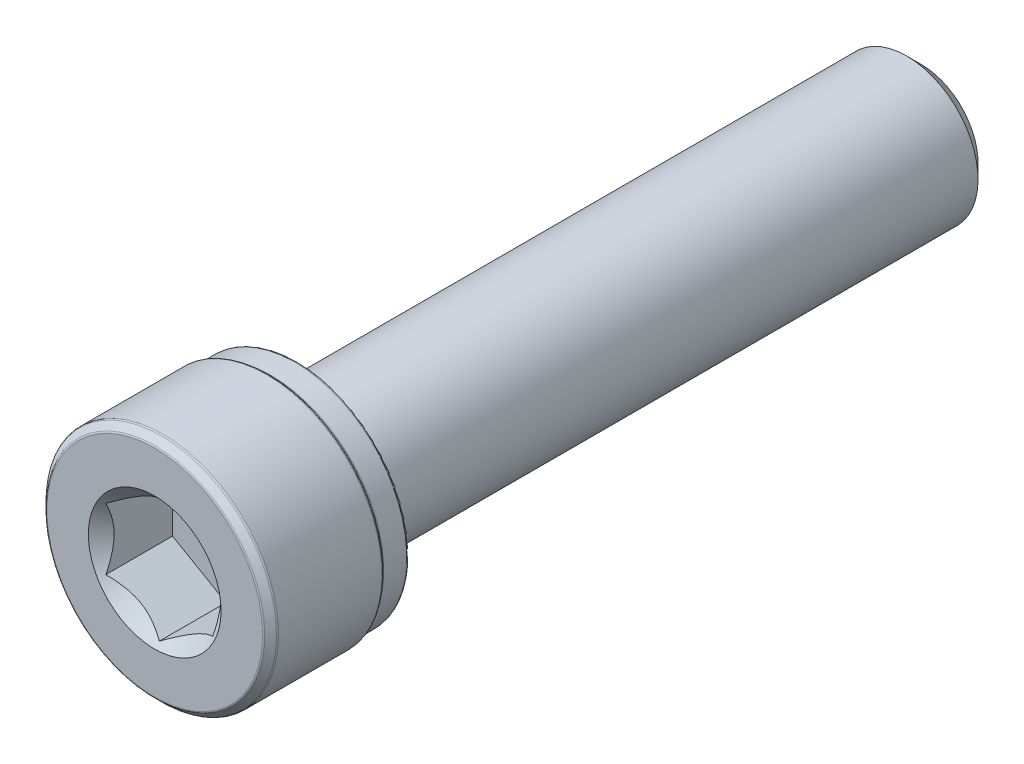
ISO-10303-21;
HEADER;
FILE_DESCRIPTION(('STEP AP214'),'2;1');
FILE_NAME('part.step','',(''),(''),'','','');
FILE_SCHEMA(('AUTOMOTIVE_DESIGN { 1 0 10303 214 1 1 1 1 }'));
ENDSEC;
DATA;
#1=APPLICATION_CONTEXT('core data for automotive mechanical design processes');
#2=APPLICATION_PROTOCOL_DEFINITION('international standard','automotive_design',2000,#1);
#3=PRODUCT_CONTEXT('',#1,'mechanical');
#4=PRODUCT('Part','Part','',(#3));
#5=PRODUCT_RELATED_PRODUCT_CATEGORY('part','',(#4));
#6=PRODUCT_DEFINITION_FORMATION('','',#4);
#7=PRODUCT_DEFINITION_CONTEXT('part definition',#1,'design');
#8=PRODUCT_DEFINITION('design','',#6,#7);
#9=PRODUCT_DEFINITION_SHAPE('','',#8);
#10=(LENGTH_UNIT() NAMED_UNIT(*) SI_UNIT(.MILLI.,.METRE.));
#11=(NAMED_UNIT(*) PLANE_ANGLE_UNIT() SI_UNIT($,.RADIAN.));
#12=(NAMED_UNIT(*) SI_UNIT($,.STERADIAN.) SOLID_ANGLE_UNIT());
#13=UNCERTAINTY_MEASURE_WITH_UNIT(LENGTH_MEASURE(1.E-05),#10,'distance_accuracy_value','');
#14=(GEOMETRIC_REPRESENTATION_CONTEXT(3) GLOBAL_UNCERTAINTY_ASSIGNED_CONTEXT((#13)) GLOBAL_UNIT_ASSIGNED_CONTEXT((#10,
#11,#12)) REPRESENTATION_CONTEXT('',''));
#15=CARTESIAN_POINT('',(0.,0.,0.));
#16=DIRECTION('',(0.,0.,1.));
#17=DIRECTION('',(1.,0.,0.));
#18=AXIS2_PLACEMENT_3D('',#15,#16,#17);
#19=CARTESIAN_POINT('',(0.,3.18810118395209,-21.5));
#20=DIRECTION('',(0.,0.,-1.));
#21=DIRECTION('',(0.,1.,0.));
#22=AXIS2_PLACEMENT_3D('',#19,#20,#21);
#23=PLANE('',#22);
#24=CARTESIAN_POINT('',(0.,0.,-21.5));
#25=DIRECTION('',(0.,0.,-1.));
#26=DIRECTION('',(0.,1.,0.));
#27=AXIS2_PLACEMENT_3D('',#24,#25,#26);
#28=CIRCLE('',#27,3.18810118395209);
#29=CARTESIAN_POINT('',(0.,3.18810118395209,-21.5));
#30=VERTEX_POINT('',#29);
#31=EDGE_CURVE('E47',#30,#30,#28,.T.);
#32=ORIENTED_EDGE('',*,*,#31,.T.);
#33=EDGE_LOOP('',(#32));
#34=FACE_BOUND('',#33,.T.);
#35=ADVANCED_FACE('F34',(#34),#23,.T.);
#36=CARTESIAN_POINT('',(0.,0.,-21.5));
#37=DIRECTION('',(0.,0.,1.));
#38=DIRECTION('',(0.,-1.,0.));
#39=AXIS2_PLACEMENT_3D('',#36,#37,#38);
#40=CONICAL_SURFACE('',#39,3.18810118395209,0.78539816339744);
#41=CARTESIAN_POINT('',(0.,0.,-20.6881011839521));
#42=DIRECTION('',(0.,0.,-1.));
#43=DIRECTION('',(0.,1.,0.));
#44=AXIS2_PLACEMENT_3D('',#41,#42,#43);
#45=CIRCLE('',#44,4.);
#46=CARTESIAN_POINT('',(0.,4.,-20.6881011839521));
#47=VERTEX_POINT('',#46);
#48=EDGE_CURVE('E153',#47,#47,#45,.T.);
#49=ORIENTED_EDGE('',*,*,#48,.T.);
#50=EDGE_LOOP('',(#49));
#51=FACE_BOUND('',#50,.T.);
#52=ORIENTED_EDGE('',*,*,#31,.F.);
#53=EDGE_LOOP('',(#52));
#54=FACE_BOUND('',#53,.T.);
#55=ADVANCED_FACE('F159',(#51,#54),#40,.T.);
#56=CARTESIAN_POINT('',(0.,0.,-21.5));
#57=DIRECTION('',(0.,0.,-1.));
#58=DIRECTION('',(0.,1.,0.));
#59=AXIS2_PLACEMENT_3D('',#56,#57,#58);
#60=CYLINDRICAL_SURFACE('',#59,4.);
#61=CARTESIAN_POINT('',(0.,0.,13.1));
#62=DIRECTION('',(0.,0.,-1.));
#63=DIRECTION('',(0.,1.,0.));
#64=AXIS2_PLACEMENT_3D('',#61,#62,#63);
#65=CIRCLE('',#64,4.);
#66=CARTESIAN_POINT('',(0.,4.,13.1));
#67=VERTEX_POINT('',#66);
#68=EDGE_CURVE('E150',#67,#67,#65,.T.);
#69=ORIENTED_EDGE('',*,*,#68,.T.);
#70=EDGE_LOOP('',(#69));
#71=FACE_BOUND('',#70,.T.);
#72=ORIENTED_EDGE('',*,*,#48,.F.);
#73=EDGE_LOOP('',(#72));
#74=FACE_BOUND('',#73,.T.);
#75=ADVANCED_FACE('F161',(#71,#74),#60,.T.);
#76=CARTESIAN_POINT('',(0.,0.,13.1));
#77=DIRECTION('',(0.,0.,-1.));
#78=DIRECTION('',(0.,1.,0.));
#79=AXIS2_PLACEMENT_3D('',#76,#77,#78);
#80=TOROIDAL_SURFACE('',#79,4.4,0.4);
#81=CARTESIAN_POINT('',(0.,0.,13.5));
#82=DIRECTION('',(0.,0.,-1.));
#83=DIRECTION('',(0.,1.,0.));
#84=AXIS2_PLACEMENT_3D('',#81,#82,#83);
#85=CIRCLE('',#84,4.4);
#86=CARTESIAN_POINT('',(0.,4.4,13.5));
#87=VERTEX_POINT('',#86);
#88=EDGE_CURVE('E147',#87,#87,#85,.T.);
#89=ORIENTED_EDGE('',*,*,#88,.T.);
#90=EDGE_LOOP('',(#89));
#91=FACE_BOUND('',#90,.T.);
#92=ORIENTED_EDGE('',*,*,#68,.F.);
#93=EDGE_LOOP('',(#92));
#94=FACE_BOUND('',#93,.T.);
#95=ADVANCED_FACE('F167',(#91,#94),#80,.F.);
#96=CARTESIAN_POINT('',(0.,6.1375,13.5));
#97=DIRECTION('',(0.,0.,-1.));
#98=DIRECTION('',(0.,1.,0.));
#99=AXIS2_PLACEMENT_3D('',#96,#97,#98);
#100=PLANE('',#99);
#101=CARTESIAN_POINT('',(0.,0.,13.5));
#102=DIRECTION('',(0.,0.,-1.));
#103=DIRECTION('',(0.,1.,0.));
#104=AXIS2_PLACEMENT_3D('',#101,#102,#103);
#105=CIRCLE('',#104,6.1375);
#106=CARTESIAN_POINT('',(0.,6.1375,13.5));
#107=VERTEX_POINT('',#106);
#108=EDGE_CURVE('E144',#107,#107,#105,.T.);
#109=ORIENTED_EDGE('',*,*,#108,.T.);
#110=EDGE_LOOP('',(#109));
#111=FACE_BOUND('',#110,.T.);
#112=ORIENTED_EDGE('',*,*,#88,.F.);
#113=EDGE_LOOP('',(#112));
#114=FACE_BOUND('',#113,.T.);
#115=ADVANCED_FACE('F173',(#111,#114),#100,.T.);
#116=CARTESIAN_POINT('',(0.,0.,13.6625));
#117=DIRECTION('',(0.,0.,-1.));
#118=DIRECTION('',(0.,1.,0.));
#119=AXIS2_PLACEMENT_3D('',#116,#117,#118);
#120=TOROIDAL_SURFACE('',#119,6.1375,0.162500000000001);
#121=CARTESIAN_POINT('',(0.,0.,13.6625));
#122=DIRECTION('',(0.,0.,-1.));
#123=DIRECTION('',(0.,1.,0.));
#124=AXIS2_PLACEMENT_3D('',#121,#122,#123);
#125=CIRCLE('',#124,6.3);
#126=CARTESIAN_POINT('',(0.,6.3,13.6625));
#127=VERTEX_POINT('',#126);
#128=EDGE_CURVE('E141',#127,#127,#125,.T.);
#129=ORIENTED_EDGE('',*,*,#128,.T.);
#130=EDGE_LOOP('',(#129));
#131=FACE_BOUND('',#130,.T.);
#132=ORIENTED_EDGE('',*,*,#108,.F.);
#133=EDGE_LOOP('',(#132));
#134=FACE_BOUND('',#133,.T.);
#135=ADVANCED_FACE('F177',(#131,#134),#120,.T.);
#136=CARTESIAN_POINT('',(0.,0.,-21.5));
#137=DIRECTION('',(0.,0.,-1.));
#138=DIRECTION('',(0.,1.,0.));
#139=AXIS2_PLACEMENT_3D('',#136,#137,#138);
#140=CYLINDRICAL_SURFACE('',#139,6.3);
#141=CARTESIAN_POINT('',(0.,0.,14.9482233047034));
#142=DIRECTION('',(0.,0.,-1.));
#143=DIRECTION('',(0.,1.,0.));
#144=AXIS2_PLACEMENT_3D('',#141,#142,#143);
#145=CIRCLE('',#144,6.3);
#146=CARTESIAN_POINT('',(0.,6.3,14.9482233047034));
#147=VERTEX_POINT('',#146);
#148=EDGE_CURVE('E138',#147,#147,#145,.T.);
#149=ORIENTED_EDGE('',*,*,#148,.T.);
#150=EDGE_LOOP('',(#149));
#151=FACE_BOUND('',#150,.T.);
#152=ORIENTED_EDGE('',*,*,#128,.F.);
#153=EDGE_LOOP('',(#152));
#154=FACE_BOUND('',#153,.T.);
#155=ADVANCED_FACE('F181',(#151,#154),#140,.T.);
#156=CARTESIAN_POINT('',(0.,0.,14.9482233047034));
#157=DIRECTION('',(0.,0.,-1.));
#158=DIRECTION('',(0.,1.,0.));
#159=AXIS2_PLACEMENT_3D('',#156,#157,#158);
#160=TOROIDAL_SURFACE('',#159,6.425,0.125);
#161=CARTESIAN_POINT('',(0.,0.,15.0366116523517));
#162=DIRECTION('',(0.,0.,-1.));
#163=DIRECTION('',(0.,1.,0.));
#164=AXIS2_PLACEMENT_3D('',#161,#162,#163);
#165=CIRCLE('',#164,6.33661165235168);
#166=CARTESIAN_POINT('',(0.,6.33661165235168,15.0366116523517));
#167=VERTEX_POINT('',#166);
#168=EDGE_CURVE('E135',#167,#167,#165,.T.);
#169=ORIENTED_EDGE('',*,*,#168,.T.);
#170=EDGE_LOOP('',(#169));
#171=FACE_BOUND('',#170,.T.);
#172=ORIENTED_EDGE('',*,*,#148,.F.);
#173=EDGE_LOOP('',(#172));
#174=FACE_BOUND('',#173,.T.);
#175=ADVANCED_FACE('F185',(#171,#174),#160,.F.);
#176=CARTESIAN_POINT('',(0.,0.,15.0366116523517));
#177=DIRECTION('',(0.,0.,1.));
#178=DIRECTION('',(0.,-1.,0.));
#179=AXIS2_PLACEMENT_3D('',#176,#177,#178);
#180=CONICAL_SURFACE('',#179,6.33661165235168,0.785398163397452);
#181=CARTESIAN_POINT('',(0.,0.,15.1633883476483));
#182=DIRECTION('',(0.,0.,-1.));
#183=DIRECTION('',(0.,1.,0.));
#184=AXIS2_PLACEMENT_3D('',#181,#182,#183);
#185=CIRCLE('',#184,6.46338834764832);
#186=CARTESIAN_POINT('',(0.,6.46338834764832,15.1633883476483));
#187=VERTEX_POINT('',#186);
#188=EDGE_CURVE('E132',#187,#187,#185,.T.);
#189=ORIENTED_EDGE('',*,*,#188,.T.);
#190=EDGE_LOOP('',(#189));
#191=FACE_BOUND('',#190,.T.);
#192=ORIENTED_EDGE('',*,*,#168,.F.);
#193=EDGE_LOOP('',(#192));
#194=FACE_BOUND('',#193,.T.);
#195=ADVANCED_FACE('F189',(#191,#194),#180,.T.);
#196=CARTESIAN_POINT('',(0.,0.,15.2517766952966));
#197=DIRECTION('',(0.,0.,-1.));
#198=DIRECTION('',(0.,1.,0.));
#199=AXIS2_PLACEMENT_3D('',#196,#197,#198);
#200=TOROIDAL_SURFACE('',#199,6.375,0.125000000000001);
#201=CARTESIAN_POINT('',(0.,0.,15.2517766952966));
#202=DIRECTION('',(0.,0.,-1.));
#203=DIRECTION('',(0.,1.,0.));
#204=AXIS2_PLACEMENT_3D('',#201,#202,#203);
#205=CIRCLE('',#204,6.5);
#206=CARTESIAN_POINT('',(0.,6.5,15.2517766952966));
#207=VERTEX_POINT('',#206);
#208=EDGE_CURVE('E129',#207,#207,#205,.T.);
#209=ORIENTED_EDGE('',*,*,#208,.T.);
#210=EDGE_LOOP('',(#209));
#211=FACE_BOUND('',#210,.T.);
#212=ORIENTED_EDGE('',*,*,#188,.F.);
#213=EDGE_LOOP('',(#212));
#214=FACE_BOUND('',#213,.T.);
#215=ADVANCED_FACE('F193',(#211,#214),#200,.T.);
#216=CARTESIAN_POINT('',(0.,0.,-21.5));
#217=DIRECTION('',(0.,0.,-1.));
#218=DIRECTION('',(0.,1.,0.));
#219=AXIS2_PLACEMENT_3D('',#216,#217,#218);
#220=CYLINDRICAL_SURFACE('',#219,6.5);
#221=CARTESIAN_POINT('',(0.,0.,21.0482233047034));
#222=DIRECTION('',(0.,0.,-1.));
#223=DIRECTION('',(0.,1.,0.));
#224=AXIS2_PLACEMENT_3D('',#221,#222,#223);
#225=CIRCLE('',#224,6.5);
#226=CARTESIAN_POINT('',(0.,6.5,21.0482233047034));
#227=VERTEX_POINT('',#226);
#228=EDGE_CURVE('E126',#227,#227,#225,.T.);
#229=ORIENTED_EDGE('',*,*,#228,.T.);
#230=EDGE_LOOP('',(#229));
#231=FACE_BOUND('',#230,.T.);
#232=ORIENTED_EDGE('',*,*,#208,.F.);
#233=EDGE_LOOP('',(#232));
#234=FACE_BOUND('',#233,.T.);
#235=ADVANCED_FACE('F197',(#231,#234),#220,.T.);
#236=CARTESIAN_POINT('',(0.,0.,21.0482233047034));
#237=DIRECTION('',(0.,0.,-1.));
#238=DIRECTION('',(0.,1.,0.));
#239=AXIS2_PLACEMENT_3D('',#236,#237,#238);
#240=TOROIDAL_SURFACE('',#239,6.375,0.125);
#241=CARTESIAN_POINT('',(0.,0.,21.1366116523517));
#242=DIRECTION('',(0.,0.,-1.));
#243=DIRECTION('',(0.,1.,0.));
#244=AXIS2_PLACEMENT_3D('',#241,#242,#243);
#245=CIRCLE('',#244,6.46338834764832);
#246=CARTESIAN_POINT('',(0.,6.46338834764832,21.1366116523517));
#247=VERTEX_POINT('',#246);
#248=EDGE_CURVE('E123',#247,#247,#245,.T.);
#249=ORIENTED_EDGE('',*,*,#248,.T.);
#250=EDGE_LOOP('',(#249));
#251=FACE_BOUND('',#250,.T.);
#252=ORIENTED_EDGE('',*,*,#228,.F.);
#253=EDGE_LOOP('',(#252));
#254=FACE_BOUND('',#253,.T.);
#255=ADVANCED_FACE('F201',(#251,#254),#240,.T.);
#256=CARTESIAN_POINT('',(0.,0.,21.1366116523517));
#257=DIRECTION('',(0.,0.,-1.));
#258=DIRECTION('',(0.,1.,0.));
#259=AXIS2_PLACEMENT_3D('',#256,#257,#258);
#260=CONICAL_SURFACE('',#259,6.46338834764832,0.785398163397447);
#261=CARTESIAN_POINT('',(0.,0.,21.4633883476483));
#262=DIRECTION('',(0.,0.,-1.));
#263=DIRECTION('',(0.,1.,0.));
#264=AXIS2_PLACEMENT_3D('',#261,#262,#263);
#265=CIRCLE('',#264,6.13661165235168);
#266=CARTESIAN_POINT('',(0.,6.13661165235168,21.4633883476483));
#267=VERTEX_POINT('',#266);
#268=EDGE_CURVE('E120',#267,#267,#265,.T.);
#269=ORIENTED_EDGE('',*,*,#268,.T.);
#270=EDGE_LOOP('',(#269));
#271=FACE_BOUND('',#270,.T.);
#272=ORIENTED_EDGE('',*,*,#248,.F.);
#273=EDGE_LOOP('',(#272));
#274=FACE_BOUND('',#273,.T.);
#275=ADVANCED_FACE('F205',(#271,#274),#260,.T.);
#276=CARTESIAN_POINT('',(0.,0.,21.375));
#277=DIRECTION('',(0.,0.,-1.));
#278=DIRECTION('',(0.,1.,0.));
#279=AXIS2_PLACEMENT_3D('',#276,#277,#278);
#280=TOROIDAL_SURFACE('',#279,6.04822330470336,0.125000000000001);
#281=CARTESIAN_POINT('',(0.,0.,21.5));
#282=DIRECTION('',(0.,0.,-1.));
#283=DIRECTION('',(0.,1.,0.));
#284=AXIS2_PLACEMENT_3D('',#281,#282,#283);
#285=CIRCLE('',#284,6.04822330470336);
#286=CARTESIAN_POINT('',(0.,6.04822330470336,21.5));
#287=VERTEX_POINT('',#286);
#288=EDGE_CURVE('E117',#287,#287,#285,.T.);
#289=ORIENTED_EDGE('',*,*,#288,.T.);
#290=EDGE_LOOP('',(#289));
#291=FACE_BOUND('',#290,.T.);
#292=ORIENTED_EDGE('',*,*,#268,.F.);
#293=EDGE_LOOP('',(#292));
#294=FACE_BOUND('',#293,.T.);
#295=ADVANCED_FACE('F209',(#291,#294),#280,.T.);
#296=CARTESIAN_POINT('',(0.,0.,21.5));
#297=DIRECTION('',(0.,0.,1.));
#298=DIRECTION('',(0.,-1.,0.));
#299=AXIS2_PLACEMENT_3D('',#296,#297,#298);
#300=PLANE('',#299);
#301=CARTESIAN_POINT('',(0.,0.,21.5));
#302=DIRECTION('',(0.,0.,1.));
#303=DIRECTION('',(1.,0.,0.));
#304=AXIS2_PLACEMENT_3D('',#301,#302,#303);
#305=CIRCLE('',#304,3.72390923627308);
#306=CARTESIAN_POINT('',(3.72390923627308,0.,21.5));
#307=VERTEX_POINT('',#306);
#308=EDGE_CURVE('E303',#307,#307,#305,.T.);
#309=ORIENTED_EDGE('',*,*,#308,.F.);
#310=EDGE_LOOP('',(#309));
#311=FACE_BOUND('',#310,.T.);
#312=ORIENTED_EDGE('',*,*,#288,.F.);
#313=EDGE_LOOP('',(#312));
#314=FACE_BOUND('',#313,.T.);
#315=ADVANCED_FACE('F213',(#311,#314),#300,.T.);
#316=CARTESIAN_POINT('',(0.,0.,21.5));
#317=DIRECTION('',(0.,0.,1.));
#318=DIRECTION('',(1.,0.,0.));
#319=AXIS2_PLACEMENT_3D('',#316,#317,#318);
#320=CONICAL_SURFACE('',#319,3.72390923627308,0.78539816339745);
#321=ORIENTED_EDGE('',*,*,#308,.T.);
#322=EDGE_LOOP('',(#321));
#323=FACE_BOUND('',#322,.T.);
#324=CARTESIAN_POINT('',(-3.0002,-1.73193533751504,21.2403078546918));
#325=CARTESIAN_POINT('',(-2.89707648504425,-1.79147372663452,21.1808206971865));
#326=CARTESIAN_POINT('',(-2.79222861066935,-1.85200767512883,21.1248273583302));
#327=CARTESIAN_POINT('',(-2.5784323282189,-1.97544301635333,21.0223049752436));
#328=CARTESIAN_POINT('',(-2.46946358862024,-2.03835614749388,20.975832972606));
#329=CARTESIAN_POINT('',(-2.24973336040297,-2.16521745390421,20.896225567381));
#330=CARTESIAN_POINT('',(-2.13902782823778,-2.22913332270056,20.8628900795073));
#331=CARTESIAN_POINT('',(-1.91517958943467,-2.35837216363117,20.811529922844));
#332=CARTESIAN_POINT('',(-1.802043720793,-2.42369118784643,20.7934669164003));
#333=CARTESIAN_POINT('',(-1.60705904380729,-2.53626564359199,20.7771692873152));
#334=CARTESIAN_POINT('',(-1.52546204599786,-2.58337569224233,20.7747567460385));
#335=CARTESIAN_POINT('',(-1.36240077116991,-2.67751916315865,20.7788218135218));
#336=CARTESIAN_POINT('',(-1.28093655070101,-2.72455255277569,20.785302538893));
#337=CARTESIAN_POINT('',(-1.11877988766163,-2.81817374583237,20.8067841013799));
#338=CARTESIAN_POINT('',(-1.0380884112157,-2.86476099147974,20.821794468832));
#339=CARTESIAN_POINT('',(-0.878091302108662,-2.95713536549224,20.8595160249307));
#340=CARTESIAN_POINT('',(-0.798785563690701,-3.00292255491614,20.8822266231875));
#341=CARTESIAN_POINT('',(-0.657993859197245,-3.0842086834051,20.9289530637186));
#342=CARTESIAN_POINT('',(-0.596196277853973,-3.1198875336289,20.9517407065455));
#343=CARTESIAN_POINT('',(-0.47371058247978,-3.19060468282507,21.0009886649221));
#344=CARTESIAN_POINT('',(-0.413022502364395,-3.22564296221629,21.0274490925309));
#345=CARTESIAN_POINT('',(-0.292947002609136,-3.29496858432307,21.083449373256));
#346=CARTESIAN_POINT('',(-0.233556167704082,-3.3292578988429,21.112979543343));
#347=CARTESIAN_POINT('',(-0.115874438532731,-3.39720147685868,21.1747314704402));
#348=CARTESIAN_POINT('',(-0.0575828957522655,-3.43085611477446,21.206951575524));
#349=CARTESIAN_POINT('',(0.000200000000000824,-3.46421708519159,21.2403078546918));
#350=B_SPLINE_CURVE_WITH_KNOTS('',3,(#324,#325,#326,#327,#328,#329,#330,#331,#332,#333,#334,
#335,#336,#337,#338,#339,#340,#341,#342,#343,#344,#345,#346,#347,#348,#349),.UNSPECIFIED.,.F.,
.F.,(4,2,2,2,2,2,2,2,2,2,2,2,4),(0.,0.399603557139307,0.801535286397847,1.19708369162343,
1.59163620080173,1.87398941755844,2.15644160919093,2.43921001247425,2.72195674032138,
2.94657516661926,3.17120044767274,3.3951375283781,3.61893808380739),.UNSPECIFIED.);
#351=CARTESIAN_POINT('',(-3.,-1.73205080756888,21.2401923788647));
#352=VERTEX_POINT('',#351);
#353=CARTESIAN_POINT('',(0.,-3.46410161513775,21.2401923788647));
#354=VERTEX_POINT('',#353);
#355=EDGE_CURVE('E101',#352,#354,#350,.T.);
#356=ORIENTED_EDGE('',*,*,#355,.F.);
#357=CARTESIAN_POINT('',(-3.,-3.63597263369801,22.4899317658186));
#358=CARTESIAN_POINT('',(-3.,-3.54821081453762,22.4222527639653));
#359=CARTESIAN_POINT('',(-3.,-3.45997854995776,22.3551742635189));
#360=CARTESIAN_POINT('',(-3.,-3.28237997949551,22.2224933181335));
#361=CARTESIAN_POINT('',(-3.,-3.19301341225037,22.1568912234073));
#362=CARTESIAN_POINT('',(-3.,-3.01230028902466,22.026971369594));
#363=CARTESIAN_POINT('',(-3.,-2.92094378054021,21.962667408983));
#364=CARTESIAN_POINT('',(-3.,-2.73671453430276,21.8362769746898));
#365=CARTESIAN_POINT('',(-3.,-2.64384190127937,21.774190348777));
#366=CARTESIAN_POINT('',(-3.,-2.45029951749767,21.6488396249979));
#367=CARTESIAN_POINT('',(-3.,-2.34951218319449,21.5857561674871));
#368=CARTESIAN_POINT('',(-3.,-2.14556933396837,21.4634753027544));
#369=CARTESIAN_POINT('',(-3.,-2.04241342144357,21.4042785545085));
#370=CARTESIAN_POINT('',(-3.,-1.83370026413672,21.2910295461651));
#371=CARTESIAN_POINT('',(-3.,-1.7281512746095,21.2369621909278));
#372=CARTESIAN_POINT('',(-3.,-1.51405629629858,21.135183407377));
#373=CARTESIAN_POINT('',(-3.,-1.40551175824851,21.0874689653899));
#374=CARTESIAN_POINT('',(-3.,-1.1962992758153,21.0045378495382));
#375=CARTESIAN_POINT('',(-3.,-1.09594180146237,20.9685458924784));
#376=CARTESIAN_POINT('',(-3.,-0.892651828129795,20.9045932060893));
#377=CARTESIAN_POINT('',(-3.,-0.789719167141594,20.8766329834358));
#378=CARTESIAN_POINT('',(-3.,-0.583697290901956,20.8307307883211));
#379=CARTESIAN_POINT('',(-3.,-0.480649626339327,20.8126054725429));
#380=CARTESIAN_POINT('',(-3.,-0.273250769977054,20.7867543887194));
#381=CARTESIAN_POINT('',(-3.,-0.168899860014964,20.7790264101634));
#382=CARTESIAN_POINT('',(-3.,0.0353613814992011,20.7746391860521));
#383=CARTESIAN_POINT('',(-3.,0.135261478415167,20.7775001300684));
#384=CARTESIAN_POINT('',(-3.,0.334290885877442,20.7930266368826));
#385=CARTESIAN_POINT('',(-3.,0.433420126307058,20.8056930812866));
#386=CARTESIAN_POINT('',(-3.,0.631874596080605,20.8403254397116));
#387=CARTESIAN_POINT('',(-3.,0.731170585274614,20.8624563348122));
#388=CARTESIAN_POINT('',(-3.,0.927562094571363,20.9147869672083));
#389=CARTESIAN_POINT('',(-3.,1.02465773123986,20.9449862759829));
#390=CARTESIAN_POINT('',(-3.,1.32263484371317,21.0492279624378));
#391=CARTESIAN_POINT('',(-3.,1.51949127420347,21.1348113474384));
#392=CARTESIAN_POINT('',(-3.,1.80760742350502,21.277589656377));
#393=CARTESIAN_POINT('',(-3.,1.90262753095824,21.3276934985151));
#394=CARTESIAN_POINT('',(-3.,2.09051797246354,21.4317906459647));
#395=CARTESIAN_POINT('',(-3.,2.18338867977823,21.4857832691553));
#396=CARTESIAN_POINT('',(-3.,2.36269431772654,21.5941374400834));
#397=CARTESIAN_POINT('',(-3.,2.44922070423858,21.6483493485577));
#398=CARTESIAN_POINT('',(-3.,2.62078869979529,21.7590849027924));
#399=CARTESIAN_POINT('',(-3.,2.70583019698247,21.8156087216473));
#400=CARTESIAN_POINT('',(-3.,2.87393748584989,21.9300950802763));
#401=CARTESIAN_POINT('',(-3.,2.95701365163953,21.9880424502656));
#402=CARTESIAN_POINT('',(-3.,3.12202586462518,22.1054926827478));
#403=CARTESIAN_POINT('',(-3.,3.20396221984363,22.1649951119776));
#404=CARTESIAN_POINT('',(-3.,3.28542059434172,22.2251343105721));
#405=B_SPLINE_CURVE_WITH_KNOTS('',3,(#357,#358,#359,#360,#361,#362,#363,#364,#365,#366,#367,
#368,#369,#370,#371,#372,#373,#374,#375,#376,#377,#378,#379,#380,#381,#382,#383,#384,#385,#386,
#387,#388,#389,#390,#391,#392,#393,#394,#395,#396,#397,#398,#399,#400,#401,#402,#403,#404),
.UNSPECIFIED.,.F.,.F.,(4,2,2,2,2,2,2,2,2,2,2,2,2,2,2,2,2,2,2,2,2,2,2,4),(0.,0.332486500650506,
0.665051055190982,1.00017918858508,1.33528426941216,1.69191962778575,2.04861529694578,
2.40422638996116,2.75966818372677,3.07924217570899,3.39883632334218,3.71224778650697,
4.02559260675559,4.3249164424547,4.62426719328911,4.92906363386979,5.23384388964463,
5.87582449637266,6.19805908905047,6.52023729642129,6.82651951595852,7.13282470921206,
7.4366739083973,7.74043933457839),.UNSPECIFIED.);
#406=CARTESIAN_POINT('',(-3.,1.73205080756887,21.2401923788647));
#407=VERTEX_POINT('',#406);
#408=EDGE_CURVE('E259',#407,#352,#405,.F.);
#409=ORIENTED_EDGE('',*,*,#408,.F.);
#410=CARTESIAN_POINT('',(0.000200000000000959,3.46421708519159,21.2403078546918));
#411=CARTESIAN_POINT('',(-0.102923514955749,3.40467869607211,21.1808206971865));
#412=CARTESIAN_POINT('',(-0.207771389330652,3.3441447475778,21.1248273583302));
#413=CARTESIAN_POINT('',(-0.421567671781099,3.22070940635329,21.0223049752436));
#414=CARTESIAN_POINT('',(-0.530536411379763,3.15779627521275,20.975832972606));
#415=CARTESIAN_POINT('',(-0.750266639597032,3.03093496880241,20.896225567381));
#416=CARTESIAN_POINT('',(-0.860972171762215,2.96701910000606,20.8628900795073));
#417=CARTESIAN_POINT('',(-1.08482041056533,2.83778025907546,20.811529922844));
#418=CARTESIAN_POINT('',(-1.197956279207,2.77246123486019,20.7934669164003));
#419=CARTESIAN_POINT('',(-1.39294095619271,2.65988677911464,20.7771692873152));
#420=CARTESIAN_POINT('',(-1.47453795400214,2.6127767304643,20.7747567460385));
#421=CARTESIAN_POINT('',(-1.63759922883009,2.51863325954797,20.7788218135218));
#422=CARTESIAN_POINT('',(-1.71906344929899,2.47159986993093,20.785302538893));
#423=CARTESIAN_POINT('',(-1.88122011233838,2.37797867687425,20.8067841013799));
#424=CARTESIAN_POINT('',(-1.96191158878431,2.33139143122688,20.821794468832));
#425=CARTESIAN_POINT('',(-2.12190869789134,2.23901705721438,20.8595160249307));
#426=CARTESIAN_POINT('',(-2.2012144363093,2.19322986779048,20.8822266231875));
#427=CARTESIAN_POINT('',(-2.34200614080276,2.11194373930152,20.9289530637186));
#428=CARTESIAN_POINT('',(-2.40380372214603,2.07626488907772,20.9517407065455));
#429=CARTESIAN_POINT('',(-2.52628941752022,2.00554773988155,21.0009886649221));
#430=CARTESIAN_POINT('',(-2.58697749763561,1.97050946049033,21.0274490925309));
#431=CARTESIAN_POINT('',(-2.70705299739086,1.90118383838355,21.083449373256));
#432=CARTESIAN_POINT('',(-2.76644383229592,1.86689452386372,21.112979543343));
#433=CARTESIAN_POINT('',(-2.88412556146727,1.79895094584794,21.1747314704402));
#434=CARTESIAN_POINT('',(-2.94241710424773,1.76529630793216,21.206951575524));
#435=CARTESIAN_POINT('',(-3.0002,1.73193533751504,21.2403078546918));
#436=B_SPLINE_CURVE_WITH_KNOTS('',3,(#410,#411,#412,#413,#414,#415,#416,#417,#418,#419,#420,
#421,#422,#423,#424,#425,#426,#427,#428,#429,#430,#431,#432,#433,#434,#435),.UNSPECIFIED.,.F.,
.F.,(4,2,2,2,2,2,2,2,2,2,2,2,4),(0.,0.39960355713931,0.801535286397851,1.19708369162344,
1.59163620080174,1.87398941755845,2.15644160919094,2.43921001247426,2.72195674032139,
2.94657516661927,3.17120044767275,3.3951375283781,3.61893808380739),.UNSPECIFIED.);
#437=CARTESIAN_POINT('',(0.,3.46410161513775,21.2401923788647));
#438=VERTEX_POINT('',#437);
#439=EDGE_CURVE('E253',#438,#407,#436,.T.);
#440=ORIENTED_EDGE('',*,*,#439,.F.);
#441=CARTESIAN_POINT('',(3.0002,1.73193533751504,21.2403078546918));
#442=CARTESIAN_POINT('',(2.89707648504425,1.79147372663452,21.1808206971865));
#443=CARTESIAN_POINT('',(2.79222861066935,1.85200767512883,21.1248273583302));
#444=CARTESIAN_POINT('',(2.5784323282189,1.97544301635334,21.0223049752436));
#445=CARTESIAN_POINT('',(2.46946358862024,2.03835614749388,20.975832972606));
#446=CARTESIAN_POINT('',(2.24973336040297,2.16521745390422,20.896225567381));
#447=CARTESIAN_POINT('',(2.13902782823779,2.22913332270057,20.8628900795073));
#448=CARTESIAN_POINT('',(1.91517958943467,2.35837216363117,20.811529922844));
#449=CARTESIAN_POINT('',(1.802043720793,2.42369118784644,20.7934669164003));
#450=CARTESIAN_POINT('',(1.6070590438073,2.53626564359199,20.7771692873152));
#451=CARTESIAN_POINT('',(1.52546204599786,2.58337569224233,20.7747567460385));
#452=CARTESIAN_POINT('',(1.36240077116991,2.67751916315865,20.7788218135218));
#453=CARTESIAN_POINT('',(1.28093655070101,2.7245525527757,20.785302538893));
#454=CARTESIAN_POINT('',(1.11877988766163,2.81817374583237,20.8067841013799));
#455=CARTESIAN_POINT('',(1.03808841121569,2.86476099147974,20.821794468832));
#456=CARTESIAN_POINT('',(0.878091302108661,2.95713536549225,20.8595160249307));
#457=CARTESIAN_POINT('',(0.7987855636907,3.00292255491614,20.8822266231875));
#458=CARTESIAN_POINT('',(0.657993859197244,3.0842086834051,20.9289530637186));
#459=CARTESIAN_POINT('',(0.596196277853971,3.11988753362891,20.9517407065455));
#460=CARTESIAN_POINT('',(0.473710582479778,3.19060468282508,21.0009886649221));
#461=CARTESIAN_POINT('',(0.413022502364395,3.2256429622163,21.0274490925309));
#462=CARTESIAN_POINT('',(0.292947002609137,3.29496858432307,21.083449373256));
#463=CARTESIAN_POINT('',(0.233556167704083,3.3292578988429,21.112979543343));
#464=CARTESIAN_POINT('',(0.115874438532733,3.39720147685868,21.1747314704402));
#465=CARTESIAN_POINT('',(0.0575828957522674,3.43085611477446,21.206951575524));
#466=CARTESIAN_POINT('',(-0.000199999999999035,3.46421708519159,21.2403078546918));
#467=B_SPLINE_CURVE_WITH_KNOTS('',3,(#441,#442,#443,#444,#445,#446,#447,#448,#449,#450,#451,
#452,#453,#454,#455,#456,#457,#458,#459,#460,#461,#462,#463,#464,#465,#466),.UNSPECIFIED.,.F.,
.F.,(4,2,2,2,2,2,2,2,2,2,2,2,4),(0.,0.399603557139309,0.801535286397848,1.19708369162343,
1.59163620080173,1.87398941755845,2.15644160919093,2.43921001247426,2.72195674032139,
2.94657516661927,3.17120044767275,3.3951375283781,3.61893808380739),.UNSPECIFIED.);
#468=CARTESIAN_POINT('',(3.,1.73205080756888,21.2401923788647));
#469=VERTEX_POINT('',#468);
#470=EDGE_CURVE('E54',#469,#438,#467,.T.);
#471=ORIENTED_EDGE('',*,*,#470,.F.);
#472=CARTESIAN_POINT('',(3.,-3.63597288679652,22.4899319610435));
#473=CARTESIAN_POINT('',(3.,-3.54821106030531,22.4222529516296));
#474=CARTESIAN_POINT('',(3.,-3.45997878837301,22.3551744436333));
#475=CARTESIAN_POINT('',(3.,-3.28238020313616,22.2224934831912));
#476=CARTESIAN_POINT('',(3.,-3.19301362846885,22.1568913809582));
#477=CARTESIAN_POINT('',(3.,-3.01230049015545,22.0269715120754));
#478=CARTESIAN_POINT('',(3.,-2.92094397400344,21.962667543904));
#479=CARTESIAN_POINT('',(3.,-2.73671471229927,21.8362770946072));
#480=CARTESIAN_POINT('',(3.,-2.64384207147677,21.7741904612511));
#481=CARTESIAN_POINT('',(3.,-2.4502996708564,21.6488397219342));
#482=CARTESIAN_POINT('',(3.,-2.34951232749049,21.5857562563578));
#483=CARTESIAN_POINT('',(3.,-2.14556945981867,21.4634753758581));
#484=CARTESIAN_POINT('',(3.,-2.04241353791073,21.404278619911));
#485=CARTESIAN_POINT('',(3.,-1.8337003615023,21.2910295967959));
#486=CARTESIAN_POINT('',(3.,-1.72815136225939,21.2369622344834));
#487=CARTESIAN_POINT('',(3.,-1.51405636398862,21.1351834376699));
#488=CARTESIAN_POINT('',(3.,-1.40551181569501,21.0874689894939));
#489=CARTESIAN_POINT('',(3.,-1.19629932897774,21.0045378694147));
#490=CARTESIAN_POINT('',(3.,-1.09594186106085,20.9685459131465));
#491=CARTESIAN_POINT('',(3.,-0.892651900852754,20.9045932270499));
#492=CARTESIAN_POINT('',(3.,-0.789719246552727,20.8766330038981));
#493=CARTESIAN_POINT('',(3.,-0.583697383488754,20.8307308062371));
#494=CARTESIAN_POINT('',(3.,-0.480649725408386,20.8126054884554));
#495=CARTESIAN_POINT('',(3.,-0.273250881841221,20.7867543991039));
#496=CARTESIAN_POINT('',(3.,-0.168899978191988,20.7790264170243));
#497=CARTESIAN_POINT('',(3.,0.0353612526515873,20.7746391846889));
#498=CARTESIAN_POINT('',(3.,0.135261345193378,20.7775001241883));
#499=CARTESIAN_POINT('',(3.,0.33429074440601,20.7930266213311));
#500=CARTESIAN_POINT('',(3.,0.433419980960244,20.8056930605799));
#501=CARTESIAN_POINT('',(3.,0.631874443085109,20.8403254082637));
#502=CARTESIAN_POINT('',(3.,0.731170428519913,20.8624562977436));
#503=CARTESIAN_POINT('',(3.,0.927561930706308,20.9147869188444));
#504=CARTESIAN_POINT('',(3.,1.0246575640236,20.9449862219443));
#505=CARTESIAN_POINT('',(3.,1.32263464105079,21.0492278821044));
#506=CARTESIAN_POINT('',(3.,1.51949104121454,21.1348112429926));
#507=CARTESIAN_POINT('',(3.,1.80760714686305,21.2775895137828));
#508=CARTESIAN_POINT('',(3.,1.9026272400217,21.3276933428327));
#509=CARTESIAN_POINT('',(3.,2.0905176533989,21.4317904636811));
#510=CARTESIAN_POINT('',(3.,2.18338834687988,21.485783073359));
#511=CARTESIAN_POINT('',(3.,2.36269395972801,21.5941372186404));
#512=CARTESIAN_POINT('',(3.,2.44922033492693,21.6483491150423));
#513=CARTESIAN_POINT('',(3.,2.62078830801949,21.7590846450798));
#514=CARTESIAN_POINT('',(3.,2.70582979405565,21.81560845181));
#515=CARTESIAN_POINT('',(3.,2.87393706089306,21.9300947863271));
#516=CARTESIAN_POINT('',(3.,2.9570132158017,21.988042144331));
#517=CARTESIAN_POINT('',(3.,3.12202540709736,22.1054923528576));
#518=CARTESIAN_POINT('',(3.,3.20396175150683,22.1649947701171));
#519=CARTESIAN_POINT('',(3.,3.28542011521452,22.225133956758));
#520=B_SPLINE_CURVE_WITH_KNOTS('',3,(#472,#473,#474,#475,#476,#477,#478,#479,#480,#481,#482,
#483,#484,#485,#486,#487,#488,#489,#490,#491,#492,#493,#494,#495,#496,#497,#498,#499,#500,#501,
#502,#503,#504,#505,#506,#507,#508,#509,#510,#511,#512,#513,#514,#515,#516,#517,#518,#519),
.UNSPECIFIED.,.F.,.F.,(4,2,2,2,2,2,2,2,2,2,2,2,2,2,2,2,2,2,2,2,2,2,2,4),(0.,0.332486531917483,
0.665051117734091,1.00017928299282,1.33528439567964,1.69191978993108,2.04861549499067,
2.4042266236009,2.75966845290149,3.07924242597876,3.39883655473963,3.71224799990754,
4.02559280216896,4.32491662442194,4.62426736179245,4.92906378770264,5.23384402881289,
5.87582452378603,6.19805906019981,6.52023721133022,6.82651938287364,7.13282452813015,
7.43667367996918,7.74043905880817),.UNSPECIFIED.);
#521=CARTESIAN_POINT('',(3.,-1.73205080756887,21.2401923788647));
#522=VERTEX_POINT('',#521);
#523=EDGE_CURVE('E12',#522,#469,#520,.T.);
#524=ORIENTED_EDGE('',*,*,#523,.F.);
#525=CARTESIAN_POINT('',(-0.000199999999998448,-3.46421708519159,21.2403078546918));
#526=CARTESIAN_POINT('',(0.10292351495575,-3.40467869607211,21.1808206971865));
#527=CARTESIAN_POINT('',(0.207771389330651,-3.3441447475778,21.1248273583302));
#528=CARTESIAN_POINT('',(0.421567671781097,-3.22070940635329,21.0223049752436));
#529=CARTESIAN_POINT('',(0.530536411379761,-3.15779627521275,20.975832972606));
#530=CARTESIAN_POINT('',(0.75026663959703,-3.03093496880241,20.896225567381));
#531=CARTESIAN_POINT('',(0.860972171762213,-2.96701910000606,20.8628900795073));
#532=CARTESIAN_POINT('',(1.08482041056533,-2.83778025907546,20.811529922844));
#533=CARTESIAN_POINT('',(1.19795627920699,-2.77246123486019,20.7934669164003));
#534=CARTESIAN_POINT('',(1.3929409561927,-2.65988677911464,20.7771692873152));
#535=CARTESIAN_POINT('',(1.47453795400213,-2.6127767304643,20.7747567460385));
#536=CARTESIAN_POINT('',(1.63759922883009,-2.51863325954798,20.7788218135218));
#537=CARTESIAN_POINT('',(1.71906344929899,-2.47159986993093,20.785302538893));
#538=CARTESIAN_POINT('',(1.88122011233837,-2.37797867687425,20.8067841013799));
#539=CARTESIAN_POINT('',(1.9619115887843,-2.33139143122689,20.821794468832));
#540=CARTESIAN_POINT('',(2.12190869789134,-2.23901705721438,20.8595160249307));
#541=CARTESIAN_POINT('',(2.2012144363093,-2.19322986779049,20.8822266231875));
#542=CARTESIAN_POINT('',(2.34200614080275,-2.11194373930152,20.9289530637186));
#543=CARTESIAN_POINT('',(2.40380372214603,-2.07626488907772,20.9517407065455));
#544=CARTESIAN_POINT('',(2.52628941752022,-2.00554773988155,21.0009886649221));
#545=CARTESIAN_POINT('',(2.5869774976356,-1.97050946049033,21.0274490925309));
#546=CARTESIAN_POINT('',(2.70705299739086,-1.90118383838355,21.083449373256));
#547=CARTESIAN_POINT('',(2.76644383229592,-1.86689452386372,21.112979543343));
#548=CARTESIAN_POINT('',(2.88412556146727,-1.79895094584794,21.1747314704402));
#549=CARTESIAN_POINT('',(2.94241710424773,-1.76529630793216,21.206951575524));
#550=CARTESIAN_POINT('',(3.0002,-1.73193533751504,21.2403078546918));
#551=B_SPLINE_CURVE_WITH_KNOTS('',3,(#525,#526,#527,#528,#529,#530,#531,#532,#533,#534,#535,
#536,#537,#538,#539,#540,#541,#542,#543,#544,#545,#546,#547,#548,#549,#550),.UNSPECIFIED.,.F.,
.F.,(4,2,2,2,2,2,2,2,2,2,2,2,4),(0.,0.399603557139306,0.801535286397845,1.19708369162343,
1.59163620080173,1.87398941755844,2.15644160919093,2.43921001247425,2.72195674032138,
2.94657516661927,3.17120044767274,3.3951375283781,3.61893808380739),.UNSPECIFIED.);
#552=EDGE_CURVE('E92',#354,#522,#551,.T.);
#553=ORIENTED_EDGE('',*,*,#552,.F.);
#554=EDGE_LOOP('',(#356,#409,#440,#471,#524,#553));
#555=FACE_BOUND('',#554,.T.);
#556=ADVANCED_FACE('F91',(#323,#555),#320,.F.);
#557=CARTESIAN_POINT('',(0.,0.,17.5));
#558=DIRECTION('',(0.,0.,1.));
#559=DIRECTION('',(1.,0.,0.));
#560=AXIS2_PLACEMENT_3D('',#557,#558,#559);
#561=PLANE('',#560);
#562=DIRECTION('',(0.866025403784438,0.5,0.));
#563=VECTOR('',#562,1.);
#564=CARTESIAN_POINT('',(0.,-3.46410161513775,17.5));
#565=LINE('',#564,#563);
#566=CARTESIAN_POINT('',(0.,-3.46410161513775,17.5));
#567=VERTEX_POINT('',#566);
#568=CARTESIAN_POINT('',(3.,-1.73205080756887,17.5));
#569=VERTEX_POINT('',#568);
#570=EDGE_CURVE('E100',#567,#569,#565,.T.);
#571=ORIENTED_EDGE('',*,*,#570,.T.);
#572=DIRECTION('',(0.,1.,0.));
#573=VECTOR('',#572,1.);
#574=CARTESIAN_POINT('',(3.,-1.73205080756887,17.5));
#575=LINE('',#574,#573);
#576=CARTESIAN_POINT('',(3.,1.73205080756888,17.5));
#577=VERTEX_POINT('',#576);
#578=EDGE_CURVE('E105',#569,#577,#575,.T.);
#579=ORIENTED_EDGE('',*,*,#578,.T.);
#580=DIRECTION('',(-0.866025403784439,0.5,0.));
#581=VECTOR('',#580,1.);
#582=CARTESIAN_POINT('',(3.,1.73205080756888,17.5));
#583=LINE('',#582,#581);
#584=CARTESIAN_POINT('',(0.,3.46410161513775,17.5));
#585=VERTEX_POINT('',#584);
#586=EDGE_CURVE('E285',#577,#585,#583,.T.);
#587=ORIENTED_EDGE('',*,*,#586,.T.);
#588=DIRECTION('',(-0.866025403784438,-0.5,0.));
#589=VECTOR('',#588,1.);
#590=CARTESIAN_POINT('',(0.,3.46410161513775,17.5));
#591=LINE('',#590,#589);
#592=CARTESIAN_POINT('',(-3.,1.73205080756887,17.5));
#593=VERTEX_POINT('',#592);
#594=EDGE_CURVE('E289',#585,#593,#591,.T.);
#595=ORIENTED_EDGE('',*,*,#594,.T.);
#596=DIRECTION('',(0.,-1.,0.));
#597=VECTOR('',#596,1.);
#598=CARTESIAN_POINT('',(-3.,1.73205080756887,17.5));
#599=LINE('',#598,#597);
#600=CARTESIAN_POINT('',(-3.,-1.73205080756888,17.5));
#601=VERTEX_POINT('',#600);
#602=EDGE_CURVE('E113',#593,#601,#599,.T.);
#603=ORIENTED_EDGE('',*,*,#602,.T.);
#604=DIRECTION('',(0.866025403784439,-0.5,0.));
#605=VECTOR('',#604,1.);
#606=CARTESIAN_POINT('',(-3.,-1.73205080756888,17.5));
#607=LINE('',#606,#605);
#608=EDGE_CURVE('E108',#601,#567,#607,.T.);
#609=ORIENTED_EDGE('',*,*,#608,.T.);
#610=EDGE_LOOP('',(#571,#579,#587,#595,#603,#609));
#611=FACE_BOUND('',#610,.T.);
#612=ADVANCED_FACE('F239',(#611),#561,.T.);
#613=CARTESIAN_POINT('',(3.,-1.73205080756887,17.5));
#614=DIRECTION('',(1.,0.,0.));
#615=DIRECTION('',(0.,1.,0.));
#616=AXIS2_PLACEMENT_3D('',#613,#614,#615);
#617=PLANE('',#616);
#618=DIRECTION('',(0.,0.,1.));
#619=VECTOR('',#618,1.);
#620=CARTESIAN_POINT('',(3.,-1.73205080756887,17.5));
#621=LINE('',#620,#619);
#622=EDGE_CURVE('E98',#569,#522,#621,.T.);
#623=ORIENTED_EDGE('',*,*,#622,.T.);
#624=ORIENTED_EDGE('',*,*,#523,.T.);
#625=DIRECTION('',(0.,0.,1.));
#626=VECTOR('',#625,1.);
#627=CARTESIAN_POINT('',(3.,1.73205080756888,17.5));
#628=LINE('',#627,#626);
#629=EDGE_CURVE('E107',#577,#469,#628,.T.);
#630=ORIENTED_EDGE('',*,*,#629,.F.);
#631=ORIENTED_EDGE('',*,*,#578,.F.);
#632=EDGE_LOOP('',(#623,#624,#630,#631));
#633=FACE_BOUND('',#632,.T.);
#634=ADVANCED_FACE('F103',(#633),#617,.F.);
#635=CARTESIAN_POINT('',(3.,1.73205080756888,17.5));
#636=DIRECTION('',(0.5,0.866025403784439,0.));
#637=DIRECTION('',(-0.866025403784439,0.5,0.));
#638=AXIS2_PLACEMENT_3D('',#635,#636,#637);
#639=PLANE('',#638);
#640=ORIENTED_EDGE('',*,*,#629,.T.);
#641=ORIENTED_EDGE('',*,*,#470,.T.);
#642=DIRECTION('',(0.,0.,1.));
#643=VECTOR('',#642,1.);
#644=CARTESIAN_POINT('',(0.,3.46410161513775,17.5));
#645=LINE('',#644,#643);
#646=EDGE_CURVE('E110',#585,#438,#645,.T.);
#647=ORIENTED_EDGE('',*,*,#646,.F.);
#648=ORIENTED_EDGE('',*,*,#586,.F.);
#649=EDGE_LOOP('',(#640,#641,#647,#648));
#650=FACE_BOUND('',#649,.T.);
#651=ADVANCED_FACE('F274',(#650),#639,.F.);
#652=CARTESIAN_POINT('',(0.,3.46410161513775,17.5));
#653=DIRECTION('',(-0.5,0.866025403784438,0.));
#654=DIRECTION('',(-0.866025403784438,-0.5,0.));
#655=AXIS2_PLACEMENT_3D('',#652,#653,#654);
#656=PLANE('',#655);
#657=ORIENTED_EDGE('',*,*,#646,.T.);
#658=ORIENTED_EDGE('',*,*,#439,.T.);
#659=DIRECTION('',(0.,0.,1.));
#660=VECTOR('',#659,1.);
#661=CARTESIAN_POINT('',(-3.,1.73205080756887,17.5));
#662=LINE('',#661,#660);
#663=EDGE_CURVE('E299',#593,#407,#662,.T.);
#664=ORIENTED_EDGE('',*,*,#663,.F.);
#665=ORIENTED_EDGE('',*,*,#594,.F.);
#666=EDGE_LOOP('',(#657,#658,#664,#665));
#667=FACE_BOUND('',#666,.T.);
#668=ADVANCED_FACE('F269',(#667),#656,.F.);
#669=CARTESIAN_POINT('',(-3.,1.73205080756887,17.5));
#670=DIRECTION('',(-1.,0.,0.));
#671=DIRECTION('',(0.,-1.,0.));
#672=AXIS2_PLACEMENT_3D('',#669,#670,#671);
#673=PLANE('',#672);
#674=ORIENTED_EDGE('',*,*,#663,.T.);
#675=ORIENTED_EDGE('',*,*,#408,.T.);
#676=DIRECTION('',(0.,0.,1.));
#677=VECTOR('',#676,1.);
#678=CARTESIAN_POINT('',(-3.,-1.73205080756888,17.5));
#679=LINE('',#678,#677);
#680=EDGE_CURVE('E296',#601,#352,#679,.T.);
#681=ORIENTED_EDGE('',*,*,#680,.F.);
#682=ORIENTED_EDGE('',*,*,#602,.F.);
#683=EDGE_LOOP('',(#674,#675,#681,#682));
#684=FACE_BOUND('',#683,.T.);
#685=ADVANCED_FACE('F266',(#684),#673,.F.);
#686=CARTESIAN_POINT('',(-3.,-1.73205080756888,17.5));
#687=DIRECTION('',(-0.5,-0.866025403784439,0.));
#688=DIRECTION('',(0.866025403784439,-0.5,0.));
#689=AXIS2_PLACEMENT_3D('',#686,#687,#688);
#690=PLANE('',#689);
#691=ORIENTED_EDGE('',*,*,#680,.T.);
#692=ORIENTED_EDGE('',*,*,#355,.T.);
#693=DIRECTION('',(0.,0.,1.));
#694=VECTOR('',#693,1.);
#695=CARTESIAN_POINT('',(0.,-3.46410161513775,17.5));
#696=LINE('',#695,#694);
#697=EDGE_CURVE('E61',#567,#354,#696,.T.);
#698=ORIENTED_EDGE('',*,*,#697,.F.);
#699=ORIENTED_EDGE('',*,*,#608,.F.);
#700=EDGE_LOOP('',(#691,#692,#698,#699));
#701=FACE_BOUND('',#700,.T.);
#702=ADVANCED_FACE('F220',(#701),#690,.F.);
#703=CARTESIAN_POINT('',(0.,-3.46410161513775,17.5));
#704=DIRECTION('',(0.5,-0.866025403784438,0.));
#705=DIRECTION('',(0.866025403784439,0.5,0.));
#706=AXIS2_PLACEMENT_3D('',#703,#704,#705);
#707=PLANE('',#706);
#708=ORIENTED_EDGE('',*,*,#697,.T.);
#709=ORIENTED_EDGE('',*,*,#552,.T.);
#710=ORIENTED_EDGE('',*,*,#622,.F.);
#711=ORIENTED_EDGE('',*,*,#570,.F.);
#712=EDGE_LOOP('',(#708,#709,#710,#711));
#713=FACE_BOUND('',#712,.T.);
#714=ADVANCED_FACE('F97',(#713),#707,.F.);
#715=CLOSED_SHELL('',(#35,#55,#75,#95,#115,#135,#155,#175,#195,#215,#235,#255,#275,#295,#315,
#556,#612,#634,#651,#668,#685,#702,#714));
#716=MANIFOLD_SOLID_BREP('B2',#715);
#717=ADVANCED_BREP_SHAPE_REPRESENTATION('',(#18,#716),#14);
#718=SHAPE_DEFINITION_REPRESENTATION(#9,#717);
ENDSEC;
END-ISO-10303-21;
